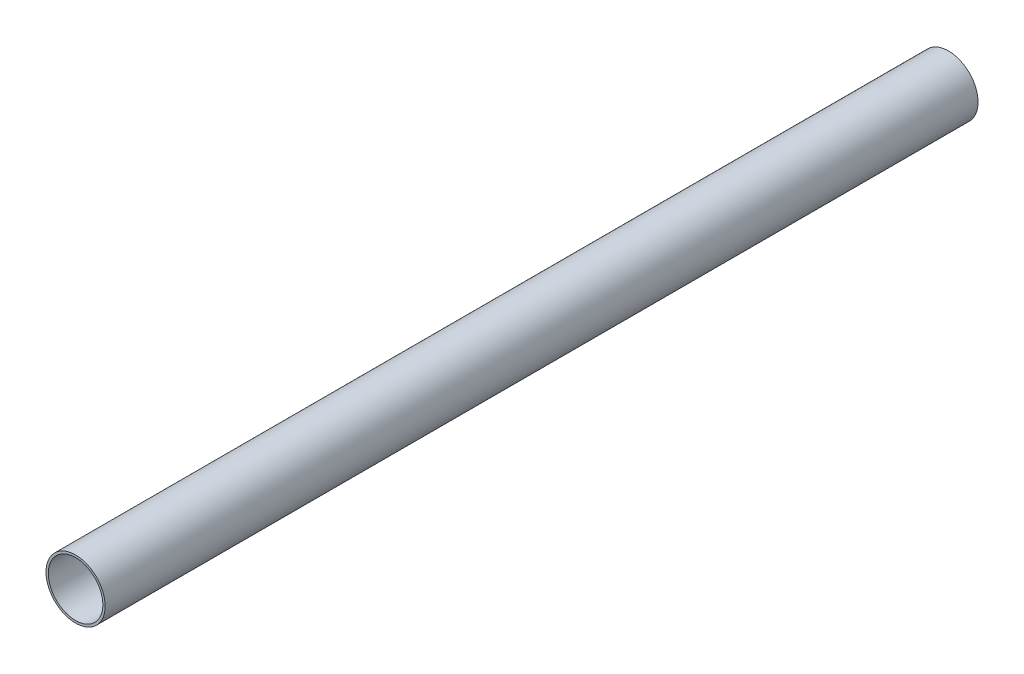
ISO-10303-21;
HEADER;
FILE_DESCRIPTION(('STEP AP214'),'2;1');
FILE_NAME('part.step','',(''),(''),'','','');
FILE_SCHEMA(('AUTOMOTIVE_DESIGN { 1 0 10303 214 1 1 1 1 }'));
ENDSEC;
DATA;
#1=APPLICATION_CONTEXT('core data for automotive mechanical design processes');
#2=APPLICATION_PROTOCOL_DEFINITION('international standard','automotive_design',2000,#1);
#3=PRODUCT_CONTEXT('',#1,'mechanical');
#4=PRODUCT('Part','Part','',(#3));
#5=PRODUCT_RELATED_PRODUCT_CATEGORY('part','',(#4));
#6=PRODUCT_DEFINITION_FORMATION('','',#4);
#7=PRODUCT_DEFINITION_CONTEXT('part definition',#1,'design');
#8=PRODUCT_DEFINITION('design','',#6,#7);
#9=PRODUCT_DEFINITION_SHAPE('','',#8);
#10=(LENGTH_UNIT() NAMED_UNIT(*) SI_UNIT(.MILLI.,.METRE.));
#11=(NAMED_UNIT(*) PLANE_ANGLE_UNIT() SI_UNIT($,.RADIAN.));
#12=(NAMED_UNIT(*) SI_UNIT($,.STERADIAN.) SOLID_ANGLE_UNIT());
#13=UNCERTAINTY_MEASURE_WITH_UNIT(LENGTH_MEASURE(1.E-05),#10,'distance_accuracy_value','');
#14=(GEOMETRIC_REPRESENTATION_CONTEXT(3) GLOBAL_UNCERTAINTY_ASSIGNED_CONTEXT((#13)) GLOBAL_UNIT_ASSIGNED_CONTEXT((#10,
#11,#12)) REPRESENTATION_CONTEXT('',''));
#15=CARTESIAN_POINT('',(0.,0.,0.));
#16=DIRECTION('',(0.,0.,1.));
#17=DIRECTION('',(1.,0.,0.));
#18=AXIS2_PLACEMENT_3D('',#15,#16,#17);
#19=CARTESIAN_POINT('',(0.,0.,609.6));
#20=DIRECTION('',(0.,0.,1.));
#21=DIRECTION('',(1.,0.,0.));
#22=AXIS2_PLACEMENT_3D('',#19,#20,#21);
#23=PLANE('',#22);
#24=CARTESIAN_POINT('',(0.,0.,609.6));
#25=DIRECTION('',(0.,0.,1.));
#26=DIRECTION('',(1.,0.,0.));
#27=AXIS2_PLACEMENT_3D('',#24,#25,#26);
#28=CIRCLE('',#27,20.6375);
#29=CARTESIAN_POINT('',(-20.6375,0.,609.6));
#30=VERTEX_POINT('',#29);
#31=EDGE_CURVE('E10',#30,#30,#28,.T.);
#32=ORIENTED_EDGE('',*,*,#31,.T.);
#33=EDGE_LOOP('',(#32));
#34=FACE_BOUND('',#33,.T.);
#35=CARTESIAN_POINT('',(0.,0.,609.6));
#36=DIRECTION('',(0.,0.,1.));
#37=DIRECTION('',(1.,0.,0.));
#38=AXIS2_PLACEMENT_3D('',#35,#36,#37);
#39=CIRCLE('',#38,19.05);
#40=CARTESIAN_POINT('',(-19.05,0.,609.6));
#41=VERTEX_POINT('',#40);
#42=EDGE_CURVE('E54',#41,#41,#39,.T.);
#43=ORIENTED_EDGE('',*,*,#42,.F.);
#44=EDGE_LOOP('',(#43));
#45=FACE_BOUND('',#44,.T.);
#46=ADVANCED_FACE('F41',(#34,#45),#23,.T.);
#47=CARTESIAN_POINT('',(0.,0.,0.));
#48=DIRECTION('',(0.,0.,1.));
#49=DIRECTION('',(1.,0.,0.));
#50=AXIS2_PLACEMENT_3D('',#47,#48,#49);
#51=PLANE('',#50);
#52=CARTESIAN_POINT('',(0.,0.,0.));
#53=DIRECTION('',(0.,0.,1.));
#54=DIRECTION('',(1.,0.,0.));
#55=AXIS2_PLACEMENT_3D('',#52,#53,#54);
#56=CIRCLE('',#55,20.6375);
#57=CARTESIAN_POINT('',(-20.6375,0.,0.));
#58=VERTEX_POINT('',#57);
#59=EDGE_CURVE('E45',#58,#58,#56,.T.);
#60=ORIENTED_EDGE('',*,*,#59,.F.);
#61=EDGE_LOOP('',(#60));
#62=FACE_BOUND('',#61,.T.);
#63=CARTESIAN_POINT('',(0.,0.,0.));
#64=DIRECTION('',(0.,0.,1.));
#65=DIRECTION('',(1.,0.,0.));
#66=AXIS2_PLACEMENT_3D('',#63,#64,#65);
#67=CIRCLE('',#66,19.05);
#68=CARTESIAN_POINT('',(-19.05,0.,0.));
#69=VERTEX_POINT('',#68);
#70=EDGE_CURVE('E56',#69,#69,#67,.T.);
#71=ORIENTED_EDGE('',*,*,#70,.T.);
#72=EDGE_LOOP('',(#71));
#73=FACE_BOUND('',#72,.T.);
#74=ADVANCED_FACE('F68',(#62,#73),#51,.F.);
#75=CARTESIAN_POINT('',(0.,0.,609.6));
#76=DIRECTION('',(0.,0.,-1.));
#77=DIRECTION('',(-1.,0.,0.));
#78=AXIS2_PLACEMENT_3D('',#75,#76,#77);
#79=CYLINDRICAL_SURFACE('',#78,20.6375);
#80=CARTESIAN_POINT('',(-20.6375,0.,609.6));
#81=CARTESIAN_POINT('',(-20.6375,0.,603.25));
#82=CARTESIAN_POINT('',(-20.6375,0.,596.9));
#83=CARTESIAN_POINT('',(-20.6375,0.,584.2));
#84=CARTESIAN_POINT('',(-20.6375,0.,577.85));
#85=CARTESIAN_POINT('',(-20.6375,0.,565.15));
#86=CARTESIAN_POINT('',(-20.6375,0.,558.8));
#87=CARTESIAN_POINT('',(-20.6375,0.,546.1));
#88=CARTESIAN_POINT('',(-20.6375,0.,539.75));
#89=CARTESIAN_POINT('',(-20.6375,0.,527.05));
#90=CARTESIAN_POINT('',(-20.6375,0.,520.7));
#91=CARTESIAN_POINT('',(-20.6375,0.,508.));
#92=CARTESIAN_POINT('',(-20.6375,0.,501.65));
#93=CARTESIAN_POINT('',(-20.6375,0.,488.95));
#94=CARTESIAN_POINT('',(-20.6375,0.,482.6));
#95=CARTESIAN_POINT('',(-20.6375,0.,469.9));
#96=CARTESIAN_POINT('',(-20.6375,0.,463.55));
#97=CARTESIAN_POINT('',(-20.6375,0.,450.85));
#98=CARTESIAN_POINT('',(-20.6375,0.,444.5));
#99=CARTESIAN_POINT('',(-20.6375,0.,431.8));
#100=CARTESIAN_POINT('',(-20.6375,0.,425.45));
#101=CARTESIAN_POINT('',(-20.6375,0.,412.75));
#102=CARTESIAN_POINT('',(-20.6375,0.,406.4));
#103=CARTESIAN_POINT('',(-20.6375,0.,393.7));
#104=CARTESIAN_POINT('',(-20.6375,0.,387.35));
#105=CARTESIAN_POINT('',(-20.6375,0.,374.65));
#106=CARTESIAN_POINT('',(-20.6375,0.,368.3));
#107=CARTESIAN_POINT('',(-20.6375,0.,355.6));
#108=CARTESIAN_POINT('',(-20.6375,0.,349.25));
#109=CARTESIAN_POINT('',(-20.6375,0.,336.55));
#110=CARTESIAN_POINT('',(-20.6375,0.,330.2));
#111=CARTESIAN_POINT('',(-20.6375,0.,317.5));
#112=CARTESIAN_POINT('',(-20.6375,0.,311.15));
#113=CARTESIAN_POINT('',(-20.6375,0.,298.45));
#114=CARTESIAN_POINT('',(-20.6375,0.,292.1));
#115=CARTESIAN_POINT('',(-20.6375,0.,279.4));
#116=CARTESIAN_POINT('',(-20.6375,0.,273.05));
#117=CARTESIAN_POINT('',(-20.6375,0.,260.35));
#118=CARTESIAN_POINT('',(-20.6375,0.,254.));
#119=CARTESIAN_POINT('',(-20.6375,0.,241.3));
#120=CARTESIAN_POINT('',(-20.6375,0.,234.95));
#121=CARTESIAN_POINT('',(-20.6375,0.,222.25));
#122=CARTESIAN_POINT('',(-20.6375,0.,215.9));
#123=CARTESIAN_POINT('',(-20.6375,0.,203.2));
#124=CARTESIAN_POINT('',(-20.6375,0.,196.85));
#125=CARTESIAN_POINT('',(-20.6375,0.,184.15));
#126=CARTESIAN_POINT('',(-20.6375,0.,177.8));
#127=CARTESIAN_POINT('',(-20.6375,0.,165.1));
#128=CARTESIAN_POINT('',(-20.6375,0.,158.75));
#129=CARTESIAN_POINT('',(-20.6375,0.,146.05));
#130=CARTESIAN_POINT('',(-20.6375,0.,139.7));
#131=CARTESIAN_POINT('',(-20.6375,0.,127.));
#132=CARTESIAN_POINT('',(-20.6375,0.,120.65));
#133=CARTESIAN_POINT('',(-20.6375,0.,107.95));
#134=CARTESIAN_POINT('',(-20.6375,0.,101.6));
#135=CARTESIAN_POINT('',(-20.6375,0.,88.9));
#136=CARTESIAN_POINT('',(-20.6375,0.,82.5500000000001));
#137=CARTESIAN_POINT('',(-20.6375,0.,69.85));
#138=CARTESIAN_POINT('',(-20.6375,0.,63.5));
#139=CARTESIAN_POINT('',(-20.6375,0.,50.8));
#140=CARTESIAN_POINT('',(-20.6375,0.,44.45));
#141=CARTESIAN_POINT('',(-20.6375,0.,31.75));
#142=CARTESIAN_POINT('',(-20.6375,0.,25.4));
#143=CARTESIAN_POINT('',(-20.6375,0.,12.7));
#144=CARTESIAN_POINT('',(-20.6375,0.,6.35000000000001));
#145=CARTESIAN_POINT('',(-20.6375,0.,0.));
#146=B_SPLINE_CURVE_WITH_KNOTS('',3,(#80,#81,#82,#83,#84,#85,#86,#87,#88,#89,#90,#91,#92,#93,
#94,#95,#96,#97,#98,#99,#100,#101,#102,#103,#104,#105,#106,#107,#108,#109,#110,#111,#112,#113,
#114,#115,#116,#117,#118,#119,#120,#121,#122,#123,#124,#125,#126,#127,#128,#129,#130,#131,#132,
#133,#134,#135,#136,#137,#138,#139,#140,#141,#142,#143,#144,#145),.UNSPECIFIED.,.F.,.F.,(4,2,2,
2,2,2,2,2,2,2,2,2,2,2,2,2,2,2,2,2,2,2,2,2,2,2,2,2,2,2,2,2,4),(0.,19.05,38.1,57.15,76.2,
95.2500000000001,114.3,133.35,152.4,171.45,190.5,209.55,228.6,247.65,266.7,285.75,304.8,323.85,
342.9,361.95,381.,400.05,419.1,438.15,457.2,476.25,495.3,514.35,533.4,552.45,571.5,590.55,
609.6),.UNSPECIFIED.);
#147=EDGE_CURVE('BSEAM43',#30,#58,#146,.T.);
#148=ORIENTED_EDGE('',*,*,#31,.F.);
#149=ORIENTED_EDGE('',*,*,#59,.T.);
#150=ORIENTED_EDGE('',*,*,#147,.T.);
#151=ORIENTED_EDGE('',*,*,#147,.F.);
#152=EDGE_LOOP('',(#148,#150,#149,#151));
#153=FACE_BOUND('',#152,.T.);
#154=ADVANCED_FACE('F43',(#153),#79,.T.);
#155=CARTESIAN_POINT('',(0.,0.,609.6));
#156=DIRECTION('',(0.,0.,-1.));
#157=DIRECTION('',(-1.,0.,0.));
#158=AXIS2_PLACEMENT_3D('',#155,#156,#157);
#159=CYLINDRICAL_SURFACE('',#158,19.05);
#160=CARTESIAN_POINT('',(-19.05,0.,609.6));
#161=CARTESIAN_POINT('',(-19.05,0.,603.25));
#162=CARTESIAN_POINT('',(-19.05,0.,596.9));
#163=CARTESIAN_POINT('',(-19.05,0.,584.2));
#164=CARTESIAN_POINT('',(-19.05,0.,577.85));
#165=CARTESIAN_POINT('',(-19.05,0.,565.15));
#166=CARTESIAN_POINT('',(-19.05,0.,558.8));
#167=CARTESIAN_POINT('',(-19.05,0.,546.1));
#168=CARTESIAN_POINT('',(-19.05,0.,539.75));
#169=CARTESIAN_POINT('',(-19.05,0.,527.05));
#170=CARTESIAN_POINT('',(-19.05,0.,520.7));
#171=CARTESIAN_POINT('',(-19.05,0.,508.));
#172=CARTESIAN_POINT('',(-19.05,0.,501.65));
#173=CARTESIAN_POINT('',(-19.05,0.,488.95));
#174=CARTESIAN_POINT('',(-19.05,0.,482.6));
#175=CARTESIAN_POINT('',(-19.05,0.,469.9));
#176=CARTESIAN_POINT('',(-19.05,0.,463.55));
#177=CARTESIAN_POINT('',(-19.05,0.,450.85));
#178=CARTESIAN_POINT('',(-19.05,0.,444.5));
#179=CARTESIAN_POINT('',(-19.05,0.,431.8));
#180=CARTESIAN_POINT('',(-19.05,0.,425.45));
#181=CARTESIAN_POINT('',(-19.05,0.,412.75));
#182=CARTESIAN_POINT('',(-19.05,0.,406.4));
#183=CARTESIAN_POINT('',(-19.05,0.,393.7));
#184=CARTESIAN_POINT('',(-19.05,0.,387.35));
#185=CARTESIAN_POINT('',(-19.05,0.,374.65));
#186=CARTESIAN_POINT('',(-19.05,0.,368.3));
#187=CARTESIAN_POINT('',(-19.05,0.,355.6));
#188=CARTESIAN_POINT('',(-19.05,0.,349.25));
#189=CARTESIAN_POINT('',(-19.05,0.,336.55));
#190=CARTESIAN_POINT('',(-19.05,0.,330.2));
#191=CARTESIAN_POINT('',(-19.05,0.,317.5));
#192=CARTESIAN_POINT('',(-19.05,0.,311.15));
#193=CARTESIAN_POINT('',(-19.05,0.,298.45));
#194=CARTESIAN_POINT('',(-19.05,0.,292.1));
#195=CARTESIAN_POINT('',(-19.05,0.,279.4));
#196=CARTESIAN_POINT('',(-19.05,0.,273.05));
#197=CARTESIAN_POINT('',(-19.05,0.,260.35));
#198=CARTESIAN_POINT('',(-19.05,0.,254.));
#199=CARTESIAN_POINT('',(-19.05,0.,241.3));
#200=CARTESIAN_POINT('',(-19.05,0.,234.95));
#201=CARTESIAN_POINT('',(-19.05,0.,222.25));
#202=CARTESIAN_POINT('',(-19.05,0.,215.9));
#203=CARTESIAN_POINT('',(-19.05,0.,203.2));
#204=CARTESIAN_POINT('',(-19.05,0.,196.85));
#205=CARTESIAN_POINT('',(-19.05,0.,184.15));
#206=CARTESIAN_POINT('',(-19.05,0.,177.8));
#207=CARTESIAN_POINT('',(-19.05,0.,165.1));
#208=CARTESIAN_POINT('',(-19.05,0.,158.75));
#209=CARTESIAN_POINT('',(-19.05,0.,146.05));
#210=CARTESIAN_POINT('',(-19.05,0.,139.7));
#211=CARTESIAN_POINT('',(-19.05,0.,127.));
#212=CARTESIAN_POINT('',(-19.05,0.,120.65));
#213=CARTESIAN_POINT('',(-19.05,0.,107.95));
#214=CARTESIAN_POINT('',(-19.05,0.,101.6));
#215=CARTESIAN_POINT('',(-19.05,0.,88.9));
#216=CARTESIAN_POINT('',(-19.05,0.,82.5500000000001));
#217=CARTESIAN_POINT('',(-19.05,0.,69.85));
#218=CARTESIAN_POINT('',(-19.05,0.,63.5));
#219=CARTESIAN_POINT('',(-19.05,0.,50.8));
#220=CARTESIAN_POINT('',(-19.05,0.,44.45));
#221=CARTESIAN_POINT('',(-19.05,0.,31.75));
#222=CARTESIAN_POINT('',(-19.05,0.,25.4));
#223=CARTESIAN_POINT('',(-19.05,0.,12.7));
#224=CARTESIAN_POINT('',(-19.05,0.,6.35000000000001));
#225=CARTESIAN_POINT('',(-19.05,0.,0.));
#226=B_SPLINE_CURVE_WITH_KNOTS('',3,(#160,#161,#162,#163,#164,#165,#166,#167,#168,#169,#170,
#171,#172,#173,#174,#175,#176,#177,#178,#179,#180,#181,#182,#183,#184,#185,#186,#187,#188,#189,
#190,#191,#192,#193,#194,#195,#196,#197,#198,#199,#200,#201,#202,#203,#204,#205,#206,#207,#208,
#209,#210,#211,#212,#213,#214,#215,#216,#217,#218,#219,#220,#221,#222,#223,#224,#225),
.UNSPECIFIED.,.F.,.F.,(4,2,2,2,2,2,2,2,2,2,2,2,2,2,2,2,2,2,2,2,2,2,2,2,2,2,2,2,2,2,2,2,4),(0.,
19.0499999999999,38.0999999999999,57.1499999999999,76.1999999999999,95.2499999999999,114.3,
133.35,152.4,171.45,190.5,209.55,228.6,247.65,266.7,285.75,304.8,323.85,342.9,361.95,381.,
400.05,419.1,438.15,457.2,476.25,495.3,514.35,533.4,552.45,571.5,590.55,609.6),.UNSPECIFIED.);
#227=EDGE_CURVE('BSEAM64',#41,#69,#226,.T.);
#228=ORIENTED_EDGE('',*,*,#42,.T.);
#229=ORIENTED_EDGE('',*,*,#70,.F.);
#230=ORIENTED_EDGE('',*,*,#227,.T.);
#231=ORIENTED_EDGE('',*,*,#227,.F.);
#232=EDGE_LOOP('',(#228,#230,#229,#231));
#233=FACE_BOUND('',#232,.T.);
#234=ADVANCED_FACE('F64',(#233),#159,.F.);
#235=CLOSED_SHELL('',(#46,#74,#154,#234));
#236=MANIFOLD_SOLID_BREP('B2',#235);
#237=ADVANCED_BREP_SHAPE_REPRESENTATION('',(#18,#236),#14);
#238=SHAPE_DEFINITION_REPRESENTATION(#9,#237);
ENDSEC;
END-ISO-10303-21;
